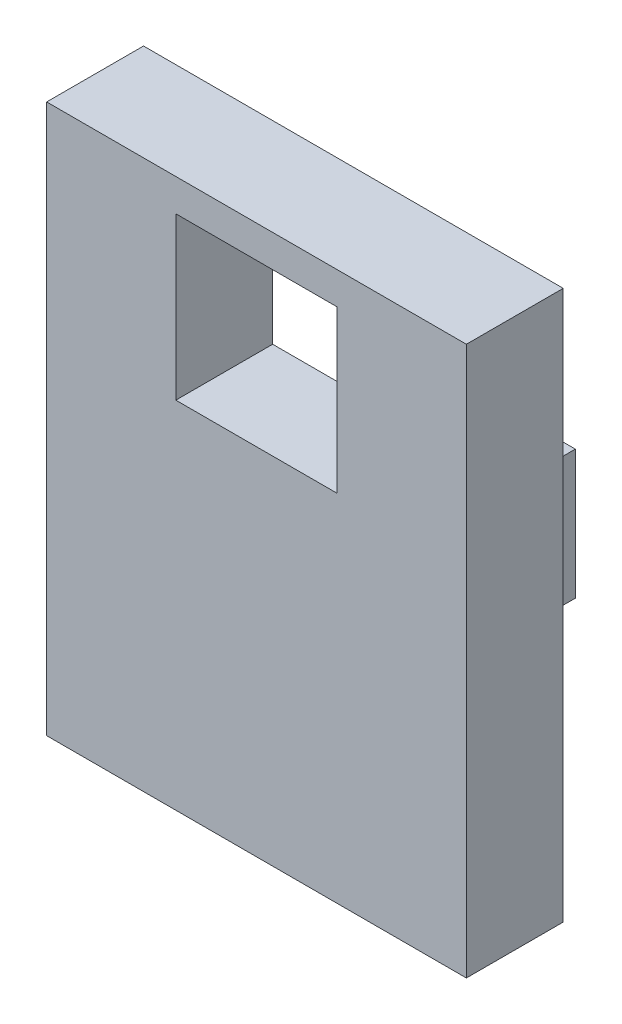
ISO-10303-21;
HEADER;
FILE_DESCRIPTION(('STEP AP214'),'2;1');
FILE_NAME('part.step','',(''),(''),'','','');
FILE_SCHEMA(('AUTOMOTIVE_DESIGN { 1 0 10303 214 1 1 1 1 }'));
ENDSEC;
DATA;
#1=APPLICATION_CONTEXT('core data for automotive mechanical design processes');
#2=APPLICATION_PROTOCOL_DEFINITION('international standard','automotive_design',2000,#1);
#3=PRODUCT_CONTEXT('',#1,'mechanical');
#4=PRODUCT('Part','Part','',(#3));
#5=PRODUCT_RELATED_PRODUCT_CATEGORY('part','',(#4));
#6=PRODUCT_DEFINITION_FORMATION('','',#4);
#7=PRODUCT_DEFINITION_CONTEXT('part definition',#1,'design');
#8=PRODUCT_DEFINITION('design','',#6,#7);
#9=PRODUCT_DEFINITION_SHAPE('','',#8);
#10=(LENGTH_UNIT() NAMED_UNIT(*) SI_UNIT(.MILLI.,.METRE.));
#11=(NAMED_UNIT(*) PLANE_ANGLE_UNIT() SI_UNIT($,.RADIAN.));
#12=(NAMED_UNIT(*) SI_UNIT($,.STERADIAN.) SOLID_ANGLE_UNIT());
#13=UNCERTAINTY_MEASURE_WITH_UNIT(LENGTH_MEASURE(1.E-05),#10,'distance_accuracy_value','');
#14=(GEOMETRIC_REPRESENTATION_CONTEXT(3) GLOBAL_UNCERTAINTY_ASSIGNED_CONTEXT((#13)) GLOBAL_UNIT_ASSIGNED_CONTEXT((#10,
#11,#12)) REPRESENTATION_CONTEXT('',''));
#15=CARTESIAN_POINT('',(0.,0.,0.));
#16=DIRECTION('',(0.,0.,1.));
#17=DIRECTION('',(1.,0.,0.));
#18=AXIS2_PLACEMENT_3D('',#15,#16,#17);
#19=CARTESIAN_POINT('',(0.,0.,-9.525));
#20=DIRECTION('',(0.,0.,-1.));
#21=DIRECTION('',(-1.,0.,0.));
#22=AXIS2_PLACEMENT_3D('',#19,#20,#21);
#23=PLANE('',#22);
#24=DIRECTION('',(0.,1.,0.));
#25=VECTOR('',#24,1.);
#26=CARTESIAN_POINT('',(13.6939587306746,16.8692209674089,-9.525));
#27=LINE('',#26,#25);
#28=CARTESIAN_POINT('',(13.6939587306747,-37.1057790325911,-9.525));
#29=VERTEX_POINT('',#28);
#30=CARTESIAN_POINT('',(13.6939587306746,16.8692209674089,-9.525));
#31=VERTEX_POINT('',#30);
#32=EDGE_CURVE('E190',#29,#31,#27,.T.);
#33=ORIENTED_EDGE('',*,*,#32,.F.);
#34=DIRECTION('',(1.,0.,0.));
#35=VECTOR('',#34,1.);
#36=CARTESIAN_POINT('',(13.6939587306747,-37.1057790325911,-9.525));
#37=LINE('',#36,#35);
#38=CARTESIAN_POINT('',(-27.5810412693253,-37.1057790325911,-9.525));
#39=VERTEX_POINT('',#38);
#40=EDGE_CURVE('E200',#39,#29,#37,.T.);
#41=ORIENTED_EDGE('',*,*,#40,.F.);
#42=DIRECTION('',(0.,-1.,0.));
#43=VECTOR('',#42,1.);
#44=CARTESIAN_POINT('',(-27.5810412693253,16.8692209674089,-9.525));
#45=LINE('',#44,#43);
#46=CARTESIAN_POINT('',(-27.5810412693253,16.8692209674089,-9.525));
#47=VERTEX_POINT('',#46);
#48=EDGE_CURVE('E197',#47,#39,#45,.T.);
#49=ORIENTED_EDGE('',*,*,#48,.F.);
#50=DIRECTION('',(-1.,0.,0.));
#51=VECTOR('',#50,1.);
#52=CARTESIAN_POINT('',(13.6939587306746,16.8692209674089,-9.525));
#53=LINE('',#52,#51);
#54=EDGE_CURVE('E193',#31,#47,#53,.T.);
#55=ORIENTED_EDGE('',*,*,#54,.F.);
#56=EDGE_LOOP('',(#33,#41,#49,#55));
#57=FACE_BOUND('',#56,.T.);
#58=DIRECTION('',(0.,-1.,0.));
#59=VECTOR('',#58,1.);
#60=CARTESIAN_POINT('',(-14.8810412693253,13.6942209674089,-9.525));
#61=LINE('',#60,#59);
#62=CARTESIAN_POINT('',(-14.8810412693253,13.6942209674089,-9.525));
#63=VERTEX_POINT('',#62);
#64=CARTESIAN_POINT('',(-14.8810412693253,-2.18077903259109,-9.525));
#65=VERTEX_POINT('',#64);
#66=EDGE_CURVE('E160',#63,#65,#61,.T.);
#67=ORIENTED_EDGE('',*,*,#66,.T.);
#68=DIRECTION('',(1.,0.,0.));
#69=VECTOR('',#68,1.);
#70=CARTESIAN_POINT('',(-14.8810412693253,-2.18077903259109,-9.525));
#71=LINE('',#70,#69);
#72=CARTESIAN_POINT('',(0.993958730674652,-2.18077903259109,-9.525));
#73=VERTEX_POINT('',#72);
#74=EDGE_CURVE('E163',#65,#73,#71,.T.);
#75=ORIENTED_EDGE('',*,*,#74,.T.);
#76=DIRECTION('',(0.,1.,0.));
#77=VECTOR('',#76,1.);
#78=CARTESIAN_POINT('',(0.993958730674649,13.6942209674089,-9.525));
#79=LINE('',#78,#77);
#80=CARTESIAN_POINT('',(0.993958730674649,13.6942209674089,-9.525));
#81=VERTEX_POINT('',#80);
#82=EDGE_CURVE('E58',#73,#81,#79,.T.);
#83=ORIENTED_EDGE('',*,*,#82,.T.);
#84=DIRECTION('',(-1.,0.,0.));
#85=VECTOR('',#84,1.);
#86=CARTESIAN_POINT('',(-14.8810412693253,13.6942209674089,-9.525));
#87=LINE('',#86,#85);
#88=EDGE_CURVE('E168',#81,#63,#87,.T.);
#89=ORIENTED_EDGE('',*,*,#88,.T.);
#90=EDGE_LOOP('',(#67,#75,#83,#89));
#91=FACE_BOUND('',#90,.T.);
#92=DIRECTION('',(-1.,0.,0.));
#93=VECTOR('',#92,1.);
#94=CARTESIAN_POINT('',(-0.593541269325343,-24.4057790325911,-9.525));
#95=LINE('',#94,#93);
#96=CARTESIAN_POINT('',(-0.593541269325343,-24.4057790325911,-9.525));
#97=VERTEX_POINT('',#96);
#98=CARTESIAN_POINT('',(-13.2935412693253,-24.4057790325911,-9.525));
#99=VERTEX_POINT('',#98);
#100=EDGE_CURVE('E130',#97,#99,#95,.T.);
#101=ORIENTED_EDGE('',*,*,#100,.F.);
#102=DIRECTION('',(0.,-1.,0.));
#103=VECTOR('',#102,1.);
#104=CARTESIAN_POINT('',(-0.593541269325343,-24.4057790325911,-9.525));
#105=LINE('',#104,#103);
#106=CARTESIAN_POINT('',(-0.593541269325339,-11.7057790325911,-9.525));
#107=VERTEX_POINT('',#106);
#108=EDGE_CURVE('E138',#107,#97,#105,.T.);
#109=ORIENTED_EDGE('',*,*,#108,.F.);
#110=DIRECTION('',(1.,0.,0.));
#111=VECTOR('',#110,1.);
#112=CARTESIAN_POINT('',(-0.593541269325339,-11.7057790325911,-9.525));
#113=LINE('',#112,#111);
#114=CARTESIAN_POINT('',(-13.2935412693253,-11.7057790325911,-9.525));
#115=VERTEX_POINT('',#114);
#116=EDGE_CURVE('E147',#115,#107,#113,.T.);
#117=ORIENTED_EDGE('',*,*,#116,.F.);
#118=DIRECTION('',(0.,1.,0.));
#119=VECTOR('',#118,1.);
#120=CARTESIAN_POINT('',(-13.2935412693253,-24.4057790325911,-9.525));
#121=LINE('',#120,#119);
#122=EDGE_CURVE('E50',#99,#115,#121,.T.);
#123=ORIENTED_EDGE('',*,*,#122,.F.);
#124=EDGE_LOOP('',(#101,#109,#117,#123));
#125=FACE_BOUND('',#124,.T.);
#126=ADVANCED_FACE('F33',(#57,#91,#125),#23,.T.);
#127=CARTESIAN_POINT('',(13.6939587306746,16.8692209674089,-9.525));
#128=DIRECTION('',(1.,0.,0.));
#129=DIRECTION('',(0.,1.,0.));
#130=AXIS2_PLACEMENT_3D('',#127,#128,#129);
#131=PLANE('',#130);
#132=DIRECTION('',(0.,1.,0.));
#133=VECTOR('',#132,1.);
#134=CARTESIAN_POINT('',(13.6939587306746,16.8692209674089,0.));
#135=LINE('',#134,#133);
#136=CARTESIAN_POINT('',(13.6939587306747,-37.1057790325911,0.));
#137=VERTEX_POINT('',#136);
#138=CARTESIAN_POINT('',(13.6939587306746,16.8692209674089,0.));
#139=VERTEX_POINT('',#138);
#140=EDGE_CURVE('E183',#137,#139,#135,.T.);
#141=ORIENTED_EDGE('',*,*,#140,.F.);
#142=DIRECTION('',(0.,0.,1.));
#143=VECTOR('',#142,1.);
#144=CARTESIAN_POINT('',(13.6939587306747,-37.1057790325911,-9.525));
#145=LINE('',#144,#143);
#146=EDGE_CURVE('E11',#29,#137,#145,.T.);
#147=ORIENTED_EDGE('',*,*,#146,.F.);
#148=ORIENTED_EDGE('',*,*,#32,.T.);
#149=DIRECTION('',(0.,0.,1.));
#150=VECTOR('',#149,1.);
#151=CARTESIAN_POINT('',(13.6939587306746,16.8692209674089,-9.525));
#152=LINE('',#151,#150);
#153=EDGE_CURVE('E37',#31,#139,#152,.T.);
#154=ORIENTED_EDGE('',*,*,#153,.T.);
#155=EDGE_LOOP('',(#141,#147,#148,#154));
#156=FACE_BOUND('',#155,.T.);
#157=ADVANCED_FACE('F35',(#156),#131,.T.);
#158=CARTESIAN_POINT('',(13.6939587306747,-37.1057790325911,-9.525));
#159=DIRECTION('',(0.,-1.,0.));
#160=DIRECTION('',(1.,0.,0.));
#161=AXIS2_PLACEMENT_3D('',#158,#159,#160);
#162=PLANE('',#161);
#163=DIRECTION('',(1.,0.,0.));
#164=VECTOR('',#163,1.);
#165=CARTESIAN_POINT('',(13.6939587306747,-37.1057790325911,0.));
#166=LINE('',#165,#164);
#167=CARTESIAN_POINT('',(-27.5810412693253,-37.1057790325911,0.));
#168=VERTEX_POINT('',#167);
#169=EDGE_CURVE('E194',#168,#137,#166,.T.);
#170=ORIENTED_EDGE('',*,*,#169,.F.);
#171=DIRECTION('',(0.,0.,1.));
#172=VECTOR('',#171,1.);
#173=CARTESIAN_POINT('',(-27.5810412693253,-37.1057790325911,-9.525));
#174=LINE('',#173,#172);
#175=EDGE_CURVE('E42',#39,#168,#174,.T.);
#176=ORIENTED_EDGE('',*,*,#175,.F.);
#177=ORIENTED_EDGE('',*,*,#40,.T.);
#178=ORIENTED_EDGE('',*,*,#146,.T.);
#179=EDGE_LOOP('',(#170,#176,#177,#178));
#180=FACE_BOUND('',#179,.T.);
#181=ADVANCED_FACE('F226',(#180),#162,.T.);
#182=CARTESIAN_POINT('',(-27.5810412693253,16.8692209674089,-9.525));
#183=DIRECTION('',(-1.,0.,0.));
#184=DIRECTION('',(0.,-1.,0.));
#185=AXIS2_PLACEMENT_3D('',#182,#183,#184);
#186=PLANE('',#185);
#187=DIRECTION('',(0.,-1.,0.));
#188=VECTOR('',#187,1.);
#189=CARTESIAN_POINT('',(-27.5810412693253,16.8692209674089,0.));
#190=LINE('',#189,#188);
#191=CARTESIAN_POINT('',(-27.5810412693253,16.8692209674089,0.));
#192=VERTEX_POINT('',#191);
#193=EDGE_CURVE('E208',#192,#168,#190,.T.);
#194=ORIENTED_EDGE('',*,*,#193,.F.);
#195=DIRECTION('',(0.,0.,1.));
#196=VECTOR('',#195,1.);
#197=CARTESIAN_POINT('',(-27.5810412693253,16.8692209674089,-9.525));
#198=LINE('',#197,#196);
#199=EDGE_CURVE('E213',#47,#192,#198,.T.);
#200=ORIENTED_EDGE('',*,*,#199,.F.);
#201=ORIENTED_EDGE('',*,*,#48,.T.);
#202=ORIENTED_EDGE('',*,*,#175,.T.);
#203=EDGE_LOOP('',(#194,#200,#201,#202));
#204=FACE_BOUND('',#203,.T.);
#205=ADVANCED_FACE('F232',(#204),#186,.T.);
#206=CARTESIAN_POINT('',(13.6939587306746,16.8692209674089,-9.525));
#207=DIRECTION('',(0.,1.,0.));
#208=DIRECTION('',(-1.,0.,0.));
#209=AXIS2_PLACEMENT_3D('',#206,#207,#208);
#210=PLANE('',#209);
#211=DIRECTION('',(-1.,0.,0.));
#212=VECTOR('',#211,1.);
#213=CARTESIAN_POINT('',(13.6939587306746,16.8692209674089,0.));
#214=LINE('',#213,#212);
#215=EDGE_CURVE('E205',#139,#192,#214,.T.);
#216=ORIENTED_EDGE('',*,*,#215,.F.);
#217=ORIENTED_EDGE('',*,*,#153,.F.);
#218=ORIENTED_EDGE('',*,*,#54,.T.);
#219=ORIENTED_EDGE('',*,*,#199,.T.);
#220=EDGE_LOOP('',(#216,#217,#218,#219));
#221=FACE_BOUND('',#220,.T.);
#222=ADVANCED_FACE('F221',(#221),#210,.T.);
#223=CARTESIAN_POINT('',(0.,0.,0.));
#224=DIRECTION('',(0.,0.,-1.));
#225=DIRECTION('',(-1.,0.,0.));
#226=AXIS2_PLACEMENT_3D('',#223,#224,#225);
#227=PLANE('',#226);
#228=DIRECTION('',(1.,0.,0.));
#229=VECTOR('',#228,1.);
#230=CARTESIAN_POINT('',(-14.8810412693253,-2.18077903259109,0.));
#231=LINE('',#230,#229);
#232=CARTESIAN_POINT('',(-14.8810412693253,-2.18077903259109,0.));
#233=VERTEX_POINT('',#232);
#234=CARTESIAN_POINT('',(0.993958730674652,-2.18077903259109,0.));
#235=VERTEX_POINT('',#234);
#236=EDGE_CURVE('E173',#233,#235,#231,.T.);
#237=ORIENTED_EDGE('',*,*,#236,.F.);
#238=DIRECTION('',(0.,-1.,0.));
#239=VECTOR('',#238,1.);
#240=CARTESIAN_POINT('',(-14.8810412693253,13.6942209674089,0.));
#241=LINE('',#240,#239);
#242=CARTESIAN_POINT('',(-14.8810412693253,13.6942209674089,0.));
#243=VERTEX_POINT('',#242);
#244=EDGE_CURVE('E158',#243,#233,#241,.T.);
#245=ORIENTED_EDGE('',*,*,#244,.F.);
#246=DIRECTION('',(-1.,0.,0.));
#247=VECTOR('',#246,1.);
#248=CARTESIAN_POINT('',(-14.8810412693253,13.6942209674089,0.));
#249=LINE('',#248,#247);
#250=CARTESIAN_POINT('',(0.993958730674649,13.6942209674089,0.));
#251=VERTEX_POINT('',#250);
#252=EDGE_CURVE('E164',#251,#243,#249,.T.);
#253=ORIENTED_EDGE('',*,*,#252,.F.);
#254=DIRECTION('',(0.,1.,0.));
#255=VECTOR('',#254,1.);
#256=CARTESIAN_POINT('',(0.993958730674649,13.6942209674089,0.));
#257=LINE('',#256,#255);
#258=EDGE_CURVE('E176',#235,#251,#257,.T.);
#259=ORIENTED_EDGE('',*,*,#258,.F.);
#260=EDGE_LOOP('',(#237,#245,#253,#259));
#261=FACE_BOUND('',#260,.T.);
#262=ORIENTED_EDGE('',*,*,#140,.T.);
#263=ORIENTED_EDGE('',*,*,#215,.T.);
#264=ORIENTED_EDGE('',*,*,#193,.T.);
#265=ORIENTED_EDGE('',*,*,#169,.T.);
#266=EDGE_LOOP('',(#262,#263,#264,#265));
#267=FACE_BOUND('',#266,.T.);
#268=ADVANCED_FACE('F223',(#261,#267),#227,.F.);
#269=CARTESIAN_POINT('',(-14.8810412693253,13.6942209674089,-9.525));
#270=DIRECTION('',(-1.,0.,0.));
#271=DIRECTION('',(0.,-1.,0.));
#272=AXIS2_PLACEMENT_3D('',#269,#270,#271);
#273=PLANE('',#272);
#274=ORIENTED_EDGE('',*,*,#244,.T.);
#275=DIRECTION('',(0.,0.,1.));
#276=VECTOR('',#275,1.);
#277=CARTESIAN_POINT('',(-14.8810412693253,-2.18077903259109,-9.525));
#278=LINE('',#277,#276);
#279=EDGE_CURVE('E171',#65,#233,#278,.T.);
#280=ORIENTED_EDGE('',*,*,#279,.F.);
#281=ORIENTED_EDGE('',*,*,#66,.F.);
#282=DIRECTION('',(0.,0.,1.));
#283=VECTOR('',#282,1.);
#284=CARTESIAN_POINT('',(-14.8810412693253,13.6942209674089,-9.525));
#285=LINE('',#284,#283);
#286=EDGE_CURVE('E181',#63,#243,#285,.T.);
#287=ORIENTED_EDGE('',*,*,#286,.T.);
#288=EDGE_LOOP('',(#274,#280,#281,#287));
#289=FACE_BOUND('',#288,.T.);
#290=ADVANCED_FACE('F247',(#289),#273,.F.);
#291=CARTESIAN_POINT('',(-14.8810412693253,13.6942209674089,-9.525));
#292=DIRECTION('',(0.,1.,0.));
#293=DIRECTION('',(0.,0.,1.));
#294=AXIS2_PLACEMENT_3D('',#291,#292,#293);
#295=PLANE('',#294);
#296=ORIENTED_EDGE('',*,*,#252,.T.);
#297=ORIENTED_EDGE('',*,*,#286,.F.);
#298=ORIENTED_EDGE('',*,*,#88,.F.);
#299=DIRECTION('',(0.,0.,1.));
#300=VECTOR('',#299,1.);
#301=CARTESIAN_POINT('',(0.993958730674649,13.6942209674089,-9.525));
#302=LINE('',#301,#300);
#303=EDGE_CURVE('E184',#81,#251,#302,.T.);
#304=ORIENTED_EDGE('',*,*,#303,.T.);
#305=EDGE_LOOP('',(#296,#297,#298,#304));
#306=FACE_BOUND('',#305,.T.);
#307=ADVANCED_FACE('F254',(#306),#295,.F.);
#308=CARTESIAN_POINT('',(0.993958730674649,13.6942209674089,-9.525));
#309=DIRECTION('',(1.,0.,0.));
#310=DIRECTION('',(0.,1.,0.));
#311=AXIS2_PLACEMENT_3D('',#308,#309,#310);
#312=PLANE('',#311);
#313=ORIENTED_EDGE('',*,*,#258,.T.);
#314=ORIENTED_EDGE('',*,*,#303,.F.);
#315=ORIENTED_EDGE('',*,*,#82,.F.);
#316=DIRECTION('',(0.,0.,1.));
#317=VECTOR('',#316,1.);
#318=CARTESIAN_POINT('',(0.993958730674652,-2.18077903259109,-9.525));
#319=LINE('',#318,#317);
#320=EDGE_CURVE('E186',#73,#235,#319,.T.);
#321=ORIENTED_EDGE('',*,*,#320,.T.);
#322=EDGE_LOOP('',(#313,#314,#315,#321));
#323=FACE_BOUND('',#322,.T.);
#324=ADVANCED_FACE('F266',(#323),#312,.F.);
#325=CARTESIAN_POINT('',(-14.8810412693253,-2.18077903259109,-9.525));
#326=DIRECTION('',(0.,-1.,0.));
#327=DIRECTION('',(0.,0.,-1.));
#328=AXIS2_PLACEMENT_3D('',#325,#326,#327);
#329=PLANE('',#328);
#330=ORIENTED_EDGE('',*,*,#236,.T.);
#331=ORIENTED_EDGE('',*,*,#320,.F.);
#332=ORIENTED_EDGE('',*,*,#74,.F.);
#333=ORIENTED_EDGE('',*,*,#279,.T.);
#334=EDGE_LOOP('',(#330,#331,#332,#333));
#335=FACE_BOUND('',#334,.T.);
#336=ADVANCED_FACE('F261',(#335),#329,.F.);
#337=CARTESIAN_POINT('',(-0.593541269325343,-24.4057790325911,-42.9625954976281));
#338=DIRECTION('',(-1.,0.,0.));
#339=DIRECTION('',(0.,-1.,0.));
#340=AXIS2_PLACEMENT_3D('',#337,#338,#339);
#341=PLANE('',#340);
#342=DIRECTION('',(0.,-1.,0.));
#343=VECTOR('',#342,1.);
#344=CARTESIAN_POINT('',(-0.593541269325343,-24.4057790325911,-25.0020832554898));
#345=LINE('',#344,#343);
#346=CARTESIAN_POINT('',(-0.593541269325339,-11.7057790325911,-25.0020832554898));
#347=VERTEX_POINT('',#346);
#348=CARTESIAN_POINT('',(-0.593541269325343,-24.4057790325911,-25.0020832554898));
#349=VERTEX_POINT('',#348);
#350=EDGE_CURVE('E159',#347,#349,#345,.T.);
#351=ORIENTED_EDGE('',*,*,#350,.F.);
#352=DIRECTION('',(0.,0.,1.));
#353=VECTOR('',#352,1.);
#354=CARTESIAN_POINT('',(-0.593541269325339,-11.7057790325911,-42.9625954976281));
#355=LINE('',#354,#353);
#356=EDGE_CURVE('E141',#347,#107,#355,.T.);
#357=ORIENTED_EDGE('',*,*,#356,.T.);
#358=ORIENTED_EDGE('',*,*,#108,.T.);
#359=DIRECTION('',(0.,0.,1.));
#360=VECTOR('',#359,1.);
#361=CARTESIAN_POINT('',(-0.593541269325343,-24.4057790325911,-42.9625954976281));
#362=LINE('',#361,#360);
#363=EDGE_CURVE('E125',#349,#97,#362,.T.);
#364=ORIENTED_EDGE('',*,*,#363,.F.);
#365=EDGE_LOOP('',(#351,#357,#358,#364));
#366=FACE_BOUND('',#365,.T.);
#367=ADVANCED_FACE('F139',(#366),#341,.F.);
#368=CARTESIAN_POINT('',(-0.593541269325343,-24.4057790325911,-42.9625954976281));
#369=DIRECTION('',(0.,1.,0.));
#370=DIRECTION('',(0.,0.,1.));
#371=AXIS2_PLACEMENT_3D('',#368,#369,#370);
#372=PLANE('',#371);
#373=DIRECTION('',(-1.,0.,0.));
#374=VECTOR('',#373,1.);
#375=CARTESIAN_POINT('',(-0.593541269325343,-24.4057790325911,-25.0020832554898));
#376=LINE('',#375,#374);
#377=CARTESIAN_POINT('',(-13.2935412693253,-24.4057790325911,-25.0020832554898));
#378=VERTEX_POINT('',#377);
#379=EDGE_CURVE('E131',#349,#378,#376,.T.);
#380=ORIENTED_EDGE('',*,*,#379,.F.);
#381=ORIENTED_EDGE('',*,*,#363,.T.);
#382=ORIENTED_EDGE('',*,*,#100,.T.);
#383=DIRECTION('',(0.,0.,1.));
#384=VECTOR('',#383,1.);
#385=CARTESIAN_POINT('',(-13.2935412693253,-24.4057790325911,-42.9625954976281));
#386=LINE('',#385,#384);
#387=EDGE_CURVE('E135',#378,#99,#386,.T.);
#388=ORIENTED_EDGE('',*,*,#387,.F.);
#389=EDGE_LOOP('',(#380,#381,#382,#388));
#390=FACE_BOUND('',#389,.T.);
#391=ADVANCED_FACE('F127',(#390),#372,.F.);
#392=CARTESIAN_POINT('',(-13.2935412693253,-24.4057790325911,-42.9625954976281));
#393=DIRECTION('',(1.,0.,0.));
#394=DIRECTION('',(0.,0.,-1.));
#395=AXIS2_PLACEMENT_3D('',#392,#393,#394);
#396=PLANE('',#395);
#397=DIRECTION('',(0.,1.,0.));
#398=VECTOR('',#397,1.);
#399=CARTESIAN_POINT('',(-13.2935412693253,-24.4057790325911,-25.0020832554898));
#400=LINE('',#399,#398);
#401=CARTESIAN_POINT('',(-13.2935412693253,-11.7057790325911,-25.0020832554898));
#402=VERTEX_POINT('',#401);
#403=EDGE_CURVE('E134',#378,#402,#400,.T.);
#404=ORIENTED_EDGE('',*,*,#403,.F.);
#405=ORIENTED_EDGE('',*,*,#387,.T.);
#406=ORIENTED_EDGE('',*,*,#122,.T.);
#407=DIRECTION('',(0.,0.,1.));
#408=VECTOR('',#407,1.);
#409=CARTESIAN_POINT('',(-13.2935412693253,-11.7057790325911,-42.9625954976281));
#410=LINE('',#409,#408);
#411=EDGE_CURVE('E153',#402,#115,#410,.T.);
#412=ORIENTED_EDGE('',*,*,#411,.F.);
#413=EDGE_LOOP('',(#404,#405,#406,#412));
#414=FACE_BOUND('',#413,.T.);
#415=ADVANCED_FACE('F279',(#414),#396,.F.);
#416=CARTESIAN_POINT('',(-0.593541269325339,-11.7057790325911,-42.9625954976281));
#417=DIRECTION('',(0.,-1.,0.));
#418=DIRECTION('',(1.,0.,0.));
#419=AXIS2_PLACEMENT_3D('',#416,#417,#418);
#420=PLANE('',#419);
#421=DIRECTION('',(1.,0.,0.));
#422=VECTOR('',#421,1.);
#423=CARTESIAN_POINT('',(-0.593541269325339,-11.7057790325911,-25.0020832554898));
#424=LINE('',#423,#422);
#425=EDGE_CURVE('E156',#402,#347,#424,.T.);
#426=ORIENTED_EDGE('',*,*,#425,.F.);
#427=ORIENTED_EDGE('',*,*,#411,.T.);
#428=ORIENTED_EDGE('',*,*,#116,.T.);
#429=ORIENTED_EDGE('',*,*,#356,.F.);
#430=EDGE_LOOP('',(#426,#427,#428,#429));
#431=FACE_BOUND('',#430,.T.);
#432=ADVANCED_FACE('F282',(#431),#420,.F.);
#433=CARTESIAN_POINT('',(105.836458730675,-143.418279032592,-25.0020832554899));
#434=DIRECTION('',(0.,0.,-1.));
#435=DIRECTION('',(0.,1.,0.));
#436=AXIS2_PLACEMENT_3D('',#433,#434,#435);
#437=PLANE('',#436);
#438=ORIENTED_EDGE('',*,*,#350,.T.);
#439=ORIENTED_EDGE('',*,*,#379,.T.);
#440=ORIENTED_EDGE('',*,*,#403,.T.);
#441=ORIENTED_EDGE('',*,*,#425,.T.);
#442=EDGE_LOOP('',(#438,#439,#440,#441));
#443=FACE_BOUND('',#442,.T.);
#444=ADVANCED_FACE('F285',(#443),#437,.T.);
#445=CLOSED_SHELL('',(#126,#157,#181,#205,#222,#268,#290,#307,#324,#336,#367,#391,#415,#432,#444));
#446=MANIFOLD_SOLID_BREP('B2',#445);
#447=ADVANCED_BREP_SHAPE_REPRESENTATION('',(#18,#446),#14);
#448=SHAPE_DEFINITION_REPRESENTATION(#9,#447);
ENDSEC;
END-ISO-10303-21;
